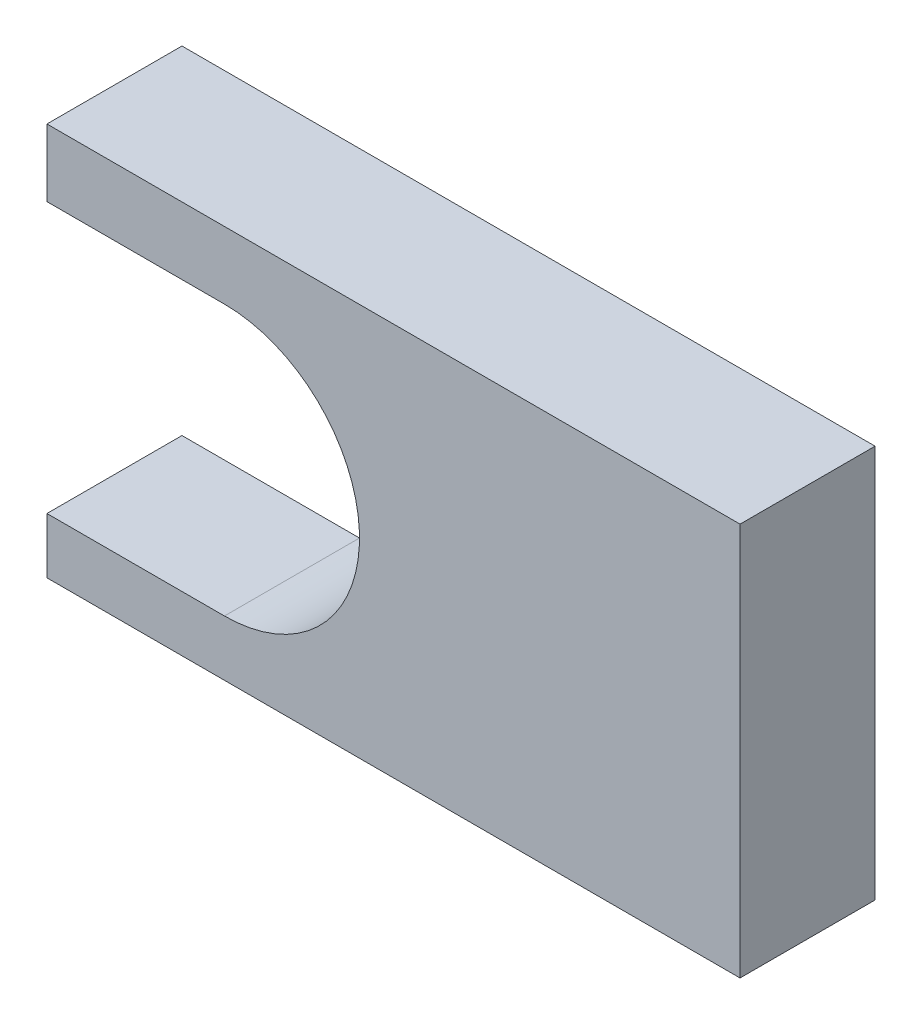
ISO-10303-21;
HEADER;
FILE_DESCRIPTION(('STEP AP214'),'2;1');
FILE_NAME('part.step','',(''),(''),'','','');
FILE_SCHEMA(('AUTOMOTIVE_DESIGN { 1 0 10303 214 1 1 1 1 }'));
ENDSEC;
DATA;
#1=APPLICATION_CONTEXT('core data for automotive mechanical design processes');
#2=APPLICATION_PROTOCOL_DEFINITION('international standard','automotive_design',2000,#1);
#3=PRODUCT_CONTEXT('',#1,'mechanical');
#4=PRODUCT('Part','Part','',(#3));
#5=PRODUCT_RELATED_PRODUCT_CATEGORY('part','',(#4));
#6=PRODUCT_DEFINITION_FORMATION('','',#4);
#7=PRODUCT_DEFINITION_CONTEXT('part definition',#1,'design');
#8=PRODUCT_DEFINITION('design','',#6,#7);
#9=PRODUCT_DEFINITION_SHAPE('','',#8);
#10=(LENGTH_UNIT() NAMED_UNIT(*) SI_UNIT(.MILLI.,.METRE.));
#11=(NAMED_UNIT(*) PLANE_ANGLE_UNIT() SI_UNIT($,.RADIAN.));
#12=(NAMED_UNIT(*) SI_UNIT($,.STERADIAN.) SOLID_ANGLE_UNIT());
#13=UNCERTAINTY_MEASURE_WITH_UNIT(LENGTH_MEASURE(1.E-05),#10,'distance_accuracy_value','');
#14=(GEOMETRIC_REPRESENTATION_CONTEXT(3) GLOBAL_UNCERTAINTY_ASSIGNED_CONTEXT((#13)) GLOBAL_UNIT_ASSIGNED_CONTEXT((#10,
#11,#12)) REPRESENTATION_CONTEXT('',''));
#15=CARTESIAN_POINT('',(0.,0.,0.));
#16=DIRECTION('',(0.,0.,1.));
#17=DIRECTION('',(1.,0.,0.));
#18=AXIS2_PLACEMENT_3D('',#15,#16,#17);
#19=CARTESIAN_POINT('',(0.,-10.,10.));
#20=DIRECTION('',(0.,0.,-1.));
#21=DIRECTION('',(-1.,0.,0.));
#22=AXIS2_PLACEMENT_3D('',#19,#20,#21);
#23=CYLINDRICAL_SURFACE('',#22,10.);
#24=CARTESIAN_POINT('',(0.,-10.,0.));
#25=DIRECTION('',(0.,0.,-1.));
#26=DIRECTION('',(1.,0.,0.));
#27=AXIS2_PLACEMENT_3D('',#24,#25,#26);
#28=CIRCLE('',#27,10.);
#29=CARTESIAN_POINT('',(0.,0.,0.));
#30=VERTEX_POINT('',#29);
#31=CARTESIAN_POINT('',(0.,-20.,0.));
#32=VERTEX_POINT('',#31);
#33=EDGE_CURVE('E145',#30,#32,#28,.T.);
#34=ORIENTED_EDGE('',*,*,#33,.T.);
#35=DIRECTION('',(0.,0.,-1.));
#36=VECTOR('',#35,1.);
#37=CARTESIAN_POINT('',(0.,-20.,10.));
#38=LINE('',#37,#36);
#39=CARTESIAN_POINT('',(0.,-20.,10.));
#40=VERTEX_POINT('',#39);
#41=EDGE_CURVE('E11',#40,#32,#38,.T.);
#42=ORIENTED_EDGE('',*,*,#41,.F.);
#43=CARTESIAN_POINT('',(0.,-10.,10.));
#44=DIRECTION('',(0.,0.,-1.));
#45=DIRECTION('',(1.,0.,0.));
#46=AXIS2_PLACEMENT_3D('',#43,#44,#45);
#47=CIRCLE('',#46,10.);
#48=CARTESIAN_POINT('',(0.,0.,10.));
#49=VERTEX_POINT('',#48);
#50=EDGE_CURVE('E169',#49,#40,#47,.T.);
#51=ORIENTED_EDGE('',*,*,#50,.F.);
#52=DIRECTION('',(0.,0.,-1.));
#53=VECTOR('',#52,1.);
#54=CARTESIAN_POINT('',(0.,0.,10.));
#55=LINE('',#54,#53);
#56=EDGE_CURVE('E141',#49,#30,#55,.T.);
#57=ORIENTED_EDGE('',*,*,#56,.T.);
#58=EDGE_LOOP('',(#34,#42,#51,#57));
#59=FACE_BOUND('',#58,.T.);
#60=ADVANCED_FACE('F45',(#59),#23,.F.);
#61=CARTESIAN_POINT('',(0.,-20.,10.));
#62=DIRECTION('',(0.,-1.,0.));
#63=DIRECTION('',(0.,0.,-1.));
#64=AXIS2_PLACEMENT_3D('',#61,#62,#63);
#65=PLANE('',#64);
#66=DIRECTION('',(-1.,0.,0.));
#67=VECTOR('',#66,1.);
#68=CARTESIAN_POINT('',(0.,-20.,0.));
#69=LINE('',#68,#67);
#70=CARTESIAN_POINT('',(-13.1459604803512,-20.,0.));
#71=VERTEX_POINT('',#70);
#72=EDGE_CURVE('E149',#32,#71,#69,.T.);
#73=ORIENTED_EDGE('',*,*,#72,.T.);
#74=DIRECTION('',(0.,0.,-1.));
#75=VECTOR('',#74,1.);
#76=CARTESIAN_POINT('',(-13.1459604803512,-20.,10.));
#77=LINE('',#76,#75);
#78=CARTESIAN_POINT('',(-13.1459604803512,-20.,10.));
#79=VERTEX_POINT('',#78);
#80=EDGE_CURVE('E54',#79,#71,#77,.T.);
#81=ORIENTED_EDGE('',*,*,#80,.F.);
#82=DIRECTION('',(-1.,0.,0.));
#83=VECTOR('',#82,1.);
#84=CARTESIAN_POINT('',(0.,-20.,10.));
#85=LINE('',#84,#83);
#86=EDGE_CURVE('E105',#40,#79,#85,.T.);
#87=ORIENTED_EDGE('',*,*,#86,.F.);
#88=ORIENTED_EDGE('',*,*,#41,.T.);
#89=EDGE_LOOP('',(#73,#81,#87,#88));
#90=FACE_BOUND('',#89,.T.);
#91=ADVANCED_FACE('F214',(#90),#65,.F.);
#92=CARTESIAN_POINT('',(-13.1459604803512,-20.,10.));
#93=DIRECTION('',(1.,0.,0.));
#94=DIRECTION('',(0.,0.,-1.));
#95=AXIS2_PLACEMENT_3D('',#92,#93,#94);
#96=PLANE('',#95);
#97=DIRECTION('',(0.,-1.,0.));
#98=VECTOR('',#97,1.);
#99=CARTESIAN_POINT('',(-13.1459604803512,-20.,0.));
#100=LINE('',#99,#98);
#101=CARTESIAN_POINT('',(-13.1459604803512,-24.1263254429087,0.));
#102=VERTEX_POINT('',#101);
#103=EDGE_CURVE('E152',#71,#102,#100,.T.);
#104=ORIENTED_EDGE('',*,*,#103,.T.);
#105=DIRECTION('',(0.,0.,-1.));
#106=VECTOR('',#105,1.);
#107=CARTESIAN_POINT('',(-13.1459604803512,-24.1263254429087,10.));
#108=LINE('',#107,#106);
#109=CARTESIAN_POINT('',(-13.1459604803512,-24.1263254429087,10.));
#110=VERTEX_POINT('',#109);
#111=EDGE_CURVE('E180',#110,#102,#108,.T.);
#112=ORIENTED_EDGE('',*,*,#111,.F.);
#113=DIRECTION('',(0.,-1.,0.));
#114=VECTOR('',#113,1.);
#115=CARTESIAN_POINT('',(-13.1459604803512,-20.,10.));
#116=LINE('',#115,#114);
#117=EDGE_CURVE('E190',#79,#110,#116,.T.);
#118=ORIENTED_EDGE('',*,*,#117,.F.);
#119=ORIENTED_EDGE('',*,*,#80,.T.);
#120=EDGE_LOOP('',(#104,#112,#118,#119));
#121=FACE_BOUND('',#120,.T.);
#122=ADVANCED_FACE('F188',(#121),#96,.F.);
#123=CARTESIAN_POINT('',(38.1801248704697,-24.1263254429087,10.));
#124=DIRECTION('',(0.,1.,0.));
#125=DIRECTION('',(-1.,0.,0.));
#126=AXIS2_PLACEMENT_3D('',#123,#124,#125);
#127=PLANE('',#126);
#128=DIRECTION('',(1.,0.,0.));
#129=VECTOR('',#128,1.);
#130=CARTESIAN_POINT('',(38.1801248704697,-24.1263254429087,0.));
#131=LINE('',#130,#129);
#132=CARTESIAN_POINT('',(38.1801248704697,-24.1263254429087,0.));
#133=VERTEX_POINT('',#132);
#134=EDGE_CURVE('E156',#102,#133,#131,.T.);
#135=ORIENTED_EDGE('',*,*,#134,.T.);
#136=DIRECTION('',(0.,0.,-1.));
#137=VECTOR('',#136,1.);
#138=CARTESIAN_POINT('',(38.1801248704697,-24.1263254429087,10.));
#139=LINE('',#138,#137);
#140=CARTESIAN_POINT('',(38.1801248704697,-24.1263254429087,10.));
#141=VERTEX_POINT('',#140);
#142=EDGE_CURVE('E176',#141,#133,#139,.T.);
#143=ORIENTED_EDGE('',*,*,#142,.F.);
#144=DIRECTION('',(1.,0.,0.));
#145=VECTOR('',#144,1.);
#146=CARTESIAN_POINT('',(-13.1459604803512,-24.1263254429087,10.));
#147=LINE('',#146,#145);
#148=EDGE_CURVE('E202',#110,#141,#147,.T.);
#149=ORIENTED_EDGE('',*,*,#148,.F.);
#150=ORIENTED_EDGE('',*,*,#111,.T.);
#151=EDGE_LOOP('',(#135,#143,#149,#150));
#152=FACE_BOUND('',#151,.T.);
#153=ADVANCED_FACE('F197',(#152),#127,.F.);
#154=CARTESIAN_POINT('',(38.1801248704697,4.98099727598787,10.));
#155=DIRECTION('',(-1.,0.,0.));
#156=DIRECTION('',(0.,0.,1.));
#157=AXIS2_PLACEMENT_3D('',#154,#155,#156);
#158=PLANE('',#157);
#159=DIRECTION('',(0.,1.,0.));
#160=VECTOR('',#159,1.);
#161=CARTESIAN_POINT('',(38.1801248704697,4.98099727598787,0.));
#162=LINE('',#161,#160);
#163=CARTESIAN_POINT('',(38.1801248704697,4.98099727598787,0.));
#164=VERTEX_POINT('',#163);
#165=EDGE_CURVE('E159',#133,#164,#162,.T.);
#166=ORIENTED_EDGE('',*,*,#165,.T.);
#167=DIRECTION('',(0.,0.,-1.));
#168=VECTOR('',#167,1.);
#169=CARTESIAN_POINT('',(38.1801248704697,4.98099727598787,10.));
#170=LINE('',#169,#168);
#171=CARTESIAN_POINT('',(38.1801248704697,4.98099727598787,10.));
#172=VERTEX_POINT('',#171);
#173=EDGE_CURVE('E134',#172,#164,#170,.T.);
#174=ORIENTED_EDGE('',*,*,#173,.F.);
#175=DIRECTION('',(0.,1.,0.));
#176=VECTOR('',#175,1.);
#177=CARTESIAN_POINT('',(38.1801248704697,4.98099727598787,10.));
#178=LINE('',#177,#176);
#179=EDGE_CURVE('E124',#141,#172,#178,.T.);
#180=ORIENTED_EDGE('',*,*,#179,.F.);
#181=ORIENTED_EDGE('',*,*,#142,.T.);
#182=EDGE_LOOP('',(#166,#174,#180,#181));
#183=FACE_BOUND('',#182,.T.);
#184=ADVANCED_FACE('F200',(#183),#158,.F.);
#185=CARTESIAN_POINT('',(-13.1459604803512,4.98099727598787,10.));
#186=DIRECTION('',(0.,-1.,0.));
#187=DIRECTION('',(0.,0.,-1.));
#188=AXIS2_PLACEMENT_3D('',#185,#186,#187);
#189=PLANE('',#188);
#190=DIRECTION('',(-1.,0.,0.));
#191=VECTOR('',#190,1.);
#192=CARTESIAN_POINT('',(-13.1459604803512,4.98099727598787,0.));
#193=LINE('',#192,#191);
#194=CARTESIAN_POINT('',(-13.1459604803512,4.98099727598787,0.));
#195=VERTEX_POINT('',#194);
#196=EDGE_CURVE('E132',#164,#195,#193,.T.);
#197=ORIENTED_EDGE('',*,*,#196,.T.);
#198=DIRECTION('',(0.,0.,-1.));
#199=VECTOR('',#198,1.);
#200=CARTESIAN_POINT('',(-13.1459604803512,4.98099727598787,10.));
#201=LINE('',#200,#199);
#202=CARTESIAN_POINT('',(-13.1459604803512,4.98099727598787,10.));
#203=VERTEX_POINT('',#202);
#204=EDGE_CURVE('E130',#203,#195,#201,.T.);
#205=ORIENTED_EDGE('',*,*,#204,.F.);
#206=DIRECTION('',(-1.,0.,0.));
#207=VECTOR('',#206,1.);
#208=CARTESIAN_POINT('',(0.,4.98099727598787,10.));
#209=LINE('',#208,#207);
#210=EDGE_CURVE('E118',#172,#203,#209,.T.);
#211=ORIENTED_EDGE('',*,*,#210,.F.);
#212=ORIENTED_EDGE('',*,*,#173,.T.);
#213=EDGE_LOOP('',(#197,#205,#211,#212));
#214=FACE_BOUND('',#213,.T.);
#215=ADVANCED_FACE('F131',(#214),#189,.F.);
#216=CARTESIAN_POINT('',(-13.1459604803512,0.,10.));
#217=DIRECTION('',(1.,0.,0.));
#218=DIRECTION('',(0.,0.,-1.));
#219=AXIS2_PLACEMENT_3D('',#216,#217,#218);
#220=PLANE('',#219);
#221=DIRECTION('',(0.,-1.,0.));
#222=VECTOR('',#221,1.);
#223=CARTESIAN_POINT('',(-13.1459604803512,0.,0.));
#224=LINE('',#223,#222);
#225=CARTESIAN_POINT('',(-13.1459604803512,0.,0.));
#226=VERTEX_POINT('',#225);
#227=EDGE_CURVE('E91',#195,#226,#224,.T.);
#228=ORIENTED_EDGE('',*,*,#227,.T.);
#229=DIRECTION('',(0.,0.,-1.));
#230=VECTOR('',#229,1.);
#231=CARTESIAN_POINT('',(-13.1459604803512,0.,10.));
#232=LINE('',#231,#230);
#233=CARTESIAN_POINT('',(-13.1459604803512,0.,10.));
#234=VERTEX_POINT('',#233);
#235=EDGE_CURVE('E135',#234,#226,#232,.T.);
#236=ORIENTED_EDGE('',*,*,#235,.F.);
#237=DIRECTION('',(0.,-1.,0.));
#238=VECTOR('',#237,1.);
#239=CARTESIAN_POINT('',(-13.1459604803512,0.,10.));
#240=LINE('',#239,#238);
#241=EDGE_CURVE('E122',#203,#234,#240,.T.);
#242=ORIENTED_EDGE('',*,*,#241,.F.);
#243=ORIENTED_EDGE('',*,*,#204,.T.);
#244=EDGE_LOOP('',(#228,#236,#242,#243));
#245=FACE_BOUND('',#244,.T.);
#246=ADVANCED_FACE('F137',(#245),#220,.F.);
#247=CARTESIAN_POINT('',(0.,0.,10.));
#248=DIRECTION('',(0.,1.,0.));
#249=DIRECTION('',(0.,0.,1.));
#250=AXIS2_PLACEMENT_3D('',#247,#248,#249);
#251=PLANE('',#250);
#252=DIRECTION('',(1.,0.,0.));
#253=VECTOR('',#252,1.);
#254=CARTESIAN_POINT('',(0.,0.,0.));
#255=LINE('',#254,#253);
#256=EDGE_CURVE('E97',#226,#30,#255,.T.);
#257=ORIENTED_EDGE('',*,*,#256,.T.);
#258=ORIENTED_EDGE('',*,*,#56,.F.);
#259=DIRECTION('',(1.,0.,0.));
#260=VECTOR('',#259,1.);
#261=CARTESIAN_POINT('',(0.,0.,10.));
#262=LINE('',#261,#260);
#263=EDGE_CURVE('E62',#234,#49,#262,.T.);
#264=ORIENTED_EDGE('',*,*,#263,.F.);
#265=ORIENTED_EDGE('',*,*,#235,.T.);
#266=EDGE_LOOP('',(#257,#258,#264,#265));
#267=FACE_BOUND('',#266,.T.);
#268=ADVANCED_FACE('F230',(#267),#251,.F.);
#269=CARTESIAN_POINT('',(0.,-10.,10.));
#270=DIRECTION('',(0.,0.,1.));
#271=DIRECTION('',(1.,0.,0.));
#272=AXIS2_PLACEMENT_3D('',#269,#270,#271);
#273=PLANE('',#272);
#274=ORIENTED_EDGE('',*,*,#50,.T.);
#275=ORIENTED_EDGE('',*,*,#86,.T.);
#276=ORIENTED_EDGE('',*,*,#117,.T.);
#277=ORIENTED_EDGE('',*,*,#148,.T.);
#278=ORIENTED_EDGE('',*,*,#179,.T.);
#279=ORIENTED_EDGE('',*,*,#210,.T.);
#280=ORIENTED_EDGE('',*,*,#241,.T.);
#281=ORIENTED_EDGE('',*,*,#263,.T.);
#282=EDGE_LOOP('',(#274,#275,#276,#277,#278,#279,#280,#281));
#283=FACE_BOUND('',#282,.T.);
#284=ADVANCED_FACE('F120',(#283),#273,.T.);
#285=CARTESIAN_POINT('',(0.,-10.,0.));
#286=DIRECTION('',(0.,0.,1.));
#287=DIRECTION('',(1.,0.,0.));
#288=AXIS2_PLACEMENT_3D('',#285,#286,#287);
#289=PLANE('',#288);
#290=ORIENTED_EDGE('',*,*,#33,.F.);
#291=ORIENTED_EDGE('',*,*,#256,.F.);
#292=ORIENTED_EDGE('',*,*,#227,.F.);
#293=ORIENTED_EDGE('',*,*,#196,.F.);
#294=ORIENTED_EDGE('',*,*,#165,.F.);
#295=ORIENTED_EDGE('',*,*,#134,.F.);
#296=ORIENTED_EDGE('',*,*,#103,.F.);
#297=ORIENTED_EDGE('',*,*,#72,.F.);
#298=EDGE_LOOP('',(#290,#291,#292,#293,#294,#295,#296,#297));
#299=FACE_BOUND('',#298,.T.);
#300=ADVANCED_FACE('F193',(#299),#289,.F.);
#301=CLOSED_SHELL('',(#60,#91,#122,#153,#184,#215,#246,#268,#284,#300));
#302=MANIFOLD_SOLID_BREP('B2',#301);
#303=ADVANCED_BREP_SHAPE_REPRESENTATION('',(#18,#302),#14);
#304=SHAPE_DEFINITION_REPRESENTATION(#9,#303);
ENDSEC;
END-ISO-10303-21;
